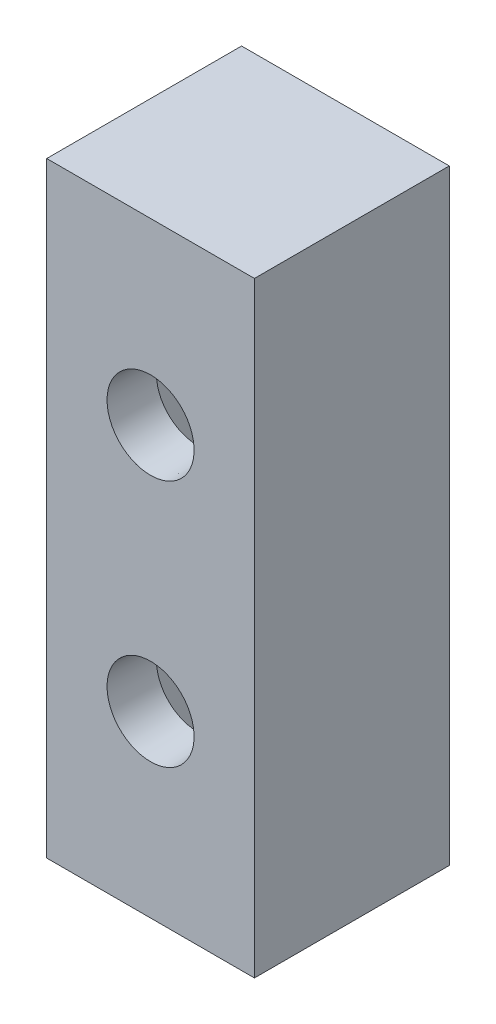
ISO-10303-21;
HEADER;
FILE_DESCRIPTION(('STEP AP214'),'2;1');
FILE_NAME('part.step','',(''),(''),'','','');
FILE_SCHEMA(('AUTOMOTIVE_DESIGN { 1 0 10303 214 1 1 1 1 }'));
ENDSEC;
DATA;
#1=APPLICATION_CONTEXT('core data for automotive mechanical design processes');
#2=APPLICATION_PROTOCOL_DEFINITION('international standard','automotive_design',2000,#1);
#3=PRODUCT_CONTEXT('',#1,'mechanical');
#4=PRODUCT('Part','Part','',(#3));
#5=PRODUCT_RELATED_PRODUCT_CATEGORY('part','',(#4));
#6=PRODUCT_DEFINITION_FORMATION('','',#4);
#7=PRODUCT_DEFINITION_CONTEXT('part definition',#1,'design');
#8=PRODUCT_DEFINITION('design','',#6,#7);
#9=PRODUCT_DEFINITION_SHAPE('','',#8);
#10=(LENGTH_UNIT() NAMED_UNIT(*) SI_UNIT(.MILLI.,.METRE.));
#11=(NAMED_UNIT(*) PLANE_ANGLE_UNIT() SI_UNIT($,.RADIAN.));
#12=(NAMED_UNIT(*) SI_UNIT($,.STERADIAN.) SOLID_ANGLE_UNIT());
#13=UNCERTAINTY_MEASURE_WITH_UNIT(LENGTH_MEASURE(1.E-05),#10,'distance_accuracy_value','');
#14=(GEOMETRIC_REPRESENTATION_CONTEXT(3) GLOBAL_UNCERTAINTY_ASSIGNED_CONTEXT((#13)) GLOBAL_UNIT_ASSIGNED_CONTEXT((#10,
#11,#12)) REPRESENTATION_CONTEXT('',''));
#15=CARTESIAN_POINT('',(0.,0.,0.));
#16=DIRECTION('',(0.,0.,1.));
#17=DIRECTION('',(1.,0.,0.));
#18=AXIS2_PLACEMENT_3D('',#15,#16,#17);
#19=CARTESIAN_POINT('',(0.,0.,3.));
#20=DIRECTION('',(0.,0.,1.));
#21=DIRECTION('',(1.,0.,0.));
#22=AXIS2_PLACEMENT_3D('',#19,#20,#21);
#23=PLANE('',#22);
#24=CARTESIAN_POINT('',(59.5125,6.99999999999998,3.));
#25=DIRECTION('',(0.,0.,-1.));
#26=DIRECTION('',(-1.,0.,0.));
#27=AXIS2_PLACEMENT_3D('',#24,#25,#26);
#28=CIRCLE('',#27,2.45722333784913);
#29=CARTESIAN_POINT('',(57.0552766621509,6.99999999999998,3.));
#30=VERTEX_POINT('',#29);
#31=EDGE_CURVE('E154',#30,#30,#28,.T.);
#32=ORIENTED_EDGE('',*,*,#31,.T.);
#33=EDGE_LOOP('',(#32));
#34=FACE_BOUND('',#33,.T.);
#35=CARTESIAN_POINT('',(59.5125,-6.99999999999998,3.));
#36=DIRECTION('',(0.,0.,-1.));
#37=DIRECTION('',(-1.,0.,0.));
#38=AXIS2_PLACEMENT_3D('',#35,#36,#37);
#39=CIRCLE('',#38,2.45722333784913);
#40=CARTESIAN_POINT('',(57.0552766621509,-6.99999999999998,3.));
#41=VERTEX_POINT('',#40);
#42=EDGE_CURVE('E174',#41,#41,#39,.T.);
#43=ORIENTED_EDGE('',*,*,#42,.T.);
#44=EDGE_LOOP('',(#43));
#45=FACE_BOUND('',#44,.T.);
#46=DIRECTION('',(-1.,0.,0.));
#47=VECTOR('',#46,1.);
#48=CARTESIAN_POINT('',(65.375,17.1,3.));
#49=LINE('',#48,#47);
#50=CARTESIAN_POINT('',(65.375,17.1,3.));
#51=VERTEX_POINT('',#50);
#52=CARTESIAN_POINT('',(53.65,17.1,3.));
#53=VERTEX_POINT('',#52);
#54=EDGE_CURVE('E121',#51,#53,#49,.T.);
#55=ORIENTED_EDGE('',*,*,#54,.T.);
#56=DIRECTION('',(0.,-1.,0.));
#57=VECTOR('',#56,1.);
#58=CARTESIAN_POINT('',(53.65,17.1,3.));
#59=LINE('',#58,#57);
#60=CARTESIAN_POINT('',(53.65,-17.1,3.));
#61=VERTEX_POINT('',#60);
#62=EDGE_CURVE('E128',#53,#61,#59,.T.);
#63=ORIENTED_EDGE('',*,*,#62,.T.);
#64=DIRECTION('',(1.,0.,0.));
#65=VECTOR('',#64,1.);
#66=CARTESIAN_POINT('',(53.65,-17.1,3.));
#67=LINE('',#66,#65);
#68=CARTESIAN_POINT('',(65.375,-17.1,3.));
#69=VERTEX_POINT('',#68);
#70=EDGE_CURVE('E133',#61,#69,#67,.T.);
#71=ORIENTED_EDGE('',*,*,#70,.T.);
#72=DIRECTION('',(0.,1.,0.));
#73=VECTOR('',#72,1.);
#74=CARTESIAN_POINT('',(65.375,-17.1,3.));
#75=LINE('',#74,#73);
#76=EDGE_CURVE('E125',#69,#51,#75,.T.);
#77=ORIENTED_EDGE('',*,*,#76,.T.);
#78=EDGE_LOOP('',(#55,#63,#71,#77));
#79=FACE_BOUND('',#78,.T.);
#80=ADVANCED_FACE('F36',(#34,#45,#79),#23,.T.);
#81=CARTESIAN_POINT('',(54.75,-16.35,-52.1540540603678));
#82=DIRECTION('',(0.,-1.,0.));
#83=DIRECTION('',(1.,0.,0.));
#84=AXIS2_PLACEMENT_3D('',#81,#82,#83);
#85=PLANE('',#84);
#86=DIRECTION('',(0.,0.,1.));
#87=VECTOR('',#86,1.);
#88=CARTESIAN_POINT('',(54.4,-16.35,-52.1540540603678));
#89=LINE('',#88,#87);
#90=CARTESIAN_POINT('',(54.4,-16.35,-8.));
#91=VERTEX_POINT('',#90);
#92=CARTESIAN_POINT('',(54.4,-16.35,0.35));
#93=VERTEX_POINT('',#92);
#94=EDGE_CURVE('E150',#91,#93,#89,.T.);
#95=ORIENTED_EDGE('',*,*,#94,.T.);
#96=DIRECTION('',(1.,0.,0.));
#97=VECTOR('',#96,1.);
#98=CARTESIAN_POINT('',(0.,-16.35,0.35));
#99=LINE('',#98,#97);
#100=CARTESIAN_POINT('',(64.625,-16.35,0.35));
#101=VERTEX_POINT('',#100);
#102=EDGE_CURVE('E155',#93,#101,#99,.T.);
#103=ORIENTED_EDGE('',*,*,#102,.T.);
#104=DIRECTION('',(0.,0.,1.));
#105=VECTOR('',#104,1.);
#106=CARTESIAN_POINT('',(64.625,-16.35,-52.1540540603678));
#107=LINE('',#106,#105);
#108=CARTESIAN_POINT('',(64.625,-16.35,-8.));
#109=VERTEX_POINT('',#108);
#110=EDGE_CURVE('E153',#109,#101,#107,.T.);
#111=ORIENTED_EDGE('',*,*,#110,.F.);
#112=DIRECTION('',(-1.,0.,0.));
#113=VECTOR('',#112,1.);
#114=CARTESIAN_POINT('',(54.75,-16.35,-8.));
#115=LINE('',#114,#113);
#116=EDGE_CURVE('E146',#109,#91,#115,.T.);
#117=ORIENTED_EDGE('',*,*,#116,.T.);
#118=EDGE_LOOP('',(#95,#103,#111,#117));
#119=FACE_BOUND('',#118,.T.);
#120=ADVANCED_FACE('F202',(#119),#85,.F.);
#121=CARTESIAN_POINT('',(64.625,-16.,-52.1540540603678));
#122=DIRECTION('',(1.,0.,0.));
#123=DIRECTION('',(0.,1.,0.));
#124=AXIS2_PLACEMENT_3D('',#121,#122,#123);
#125=PLANE('',#124);
#126=ORIENTED_EDGE('',*,*,#110,.T.);
#127=DIRECTION('',(0.,1.,0.));
#128=VECTOR('',#127,1.);
#129=CARTESIAN_POINT('',(64.625,0.,0.35));
#130=LINE('',#129,#128);
#131=CARTESIAN_POINT('',(64.625,16.35,0.35));
#132=VERTEX_POINT('',#131);
#133=EDGE_CURVE('E158',#101,#132,#130,.T.);
#134=ORIENTED_EDGE('',*,*,#133,.T.);
#135=DIRECTION('',(0.,0.,1.));
#136=VECTOR('',#135,1.);
#137=CARTESIAN_POINT('',(64.625,16.35,-52.1540540603678));
#138=LINE('',#137,#136);
#139=CARTESIAN_POINT('',(64.625,16.35,-8.));
#140=VERTEX_POINT('',#139);
#141=EDGE_CURVE('E138',#140,#132,#138,.T.);
#142=ORIENTED_EDGE('',*,*,#141,.F.);
#143=DIRECTION('',(0.,-1.,0.));
#144=VECTOR('',#143,1.);
#145=CARTESIAN_POINT('',(64.625,-16.,-8.));
#146=LINE('',#145,#144);
#147=EDGE_CURVE('E168',#140,#109,#146,.T.);
#148=ORIENTED_EDGE('',*,*,#147,.T.);
#149=EDGE_LOOP('',(#126,#134,#142,#148));
#150=FACE_BOUND('',#149,.T.);
#151=ADVANCED_FACE('F209',(#150),#125,.F.);
#152=CARTESIAN_POINT('',(64.275,16.35,-52.1540540603678));
#153=DIRECTION('',(0.,1.,0.));
#154=DIRECTION('',(-1.,0.,0.));
#155=AXIS2_PLACEMENT_3D('',#152,#153,#154);
#156=PLANE('',#155);
#157=ORIENTED_EDGE('',*,*,#141,.T.);
#158=DIRECTION('',(-1.,0.,0.));
#159=VECTOR('',#158,1.);
#160=CARTESIAN_POINT('',(0.,16.35,0.35));
#161=LINE('',#160,#159);
#162=CARTESIAN_POINT('',(54.4,16.35,0.35));
#163=VERTEX_POINT('',#162);
#164=EDGE_CURVE('E46',#132,#163,#161,.T.);
#165=ORIENTED_EDGE('',*,*,#164,.T.);
#166=DIRECTION('',(0.,0.,1.));
#167=VECTOR('',#166,1.);
#168=CARTESIAN_POINT('',(54.4,16.35,-52.1540540603678));
#169=LINE('',#168,#167);
#170=CARTESIAN_POINT('',(54.4,16.35,-8.));
#171=VERTEX_POINT('',#170);
#172=EDGE_CURVE('E135',#171,#163,#169,.T.);
#173=ORIENTED_EDGE('',*,*,#172,.F.);
#174=DIRECTION('',(1.,0.,0.));
#175=VECTOR('',#174,1.);
#176=CARTESIAN_POINT('',(64.275,16.35,-8.));
#177=LINE('',#176,#175);
#178=EDGE_CURVE('E74',#171,#140,#177,.T.);
#179=ORIENTED_EDGE('',*,*,#178,.T.);
#180=EDGE_LOOP('',(#157,#165,#173,#179));
#181=FACE_BOUND('',#180,.T.);
#182=ADVANCED_FACE('F217',(#181),#156,.F.);
#183=CARTESIAN_POINT('',(54.4,16.,-52.1540540603678));
#184=DIRECTION('',(-1.,0.,0.));
#185=DIRECTION('',(0.,-1.,0.));
#186=AXIS2_PLACEMENT_3D('',#183,#184,#185);
#187=PLANE('',#186);
#188=ORIENTED_EDGE('',*,*,#172,.T.);
#189=DIRECTION('',(0.,-1.,0.));
#190=VECTOR('',#189,1.);
#191=CARTESIAN_POINT('',(54.4,0.,0.35));
#192=LINE('',#191,#190);
#193=EDGE_CURVE('E13',#163,#93,#192,.T.);
#194=ORIENTED_EDGE('',*,*,#193,.T.);
#195=ORIENTED_EDGE('',*,*,#94,.F.);
#196=DIRECTION('',(0.,1.,0.));
#197=VECTOR('',#196,1.);
#198=CARTESIAN_POINT('',(54.4,16.,-8.));
#199=LINE('',#198,#197);
#200=EDGE_CURVE('E98',#91,#171,#199,.T.);
#201=ORIENTED_EDGE('',*,*,#200,.T.);
#202=EDGE_LOOP('',(#188,#194,#195,#201));
#203=FACE_BOUND('',#202,.T.);
#204=ADVANCED_FACE('F214',(#203),#187,.F.);
#205=CARTESIAN_POINT('',(53.65,17.1,-52.1540540603678));
#206=DIRECTION('',(-1.,0.,0.));
#207=DIRECTION('',(0.,0.,1.));
#208=AXIS2_PLACEMENT_3D('',#205,#206,#207);
#209=PLANE('',#208);
#210=DIRECTION('',(0.,1.,0.));
#211=VECTOR('',#210,1.);
#212=CARTESIAN_POINT('',(53.65,17.1,-8.));
#213=LINE('',#212,#211);
#214=CARTESIAN_POINT('',(53.65,-17.1,-8.));
#215=VERTEX_POINT('',#214);
#216=CARTESIAN_POINT('',(53.65,17.1,-8.));
#217=VERTEX_POINT('',#216);
#218=EDGE_CURVE('E92',#215,#217,#213,.T.);
#219=ORIENTED_EDGE('',*,*,#218,.F.);
#220=DIRECTION('',(0.,0.,1.));
#221=VECTOR('',#220,1.);
#222=CARTESIAN_POINT('',(53.65,-17.1,-52.1540540603678));
#223=LINE('',#222,#221);
#224=EDGE_CURVE('E124',#215,#61,#223,.T.);
#225=ORIENTED_EDGE('',*,*,#224,.T.);
#226=ORIENTED_EDGE('',*,*,#62,.F.);
#227=DIRECTION('',(0.,0.,1.));
#228=VECTOR('',#227,1.);
#229=CARTESIAN_POINT('',(53.65,17.1,-52.1540540603678));
#230=LINE('',#229,#228);
#231=EDGE_CURVE('E117',#217,#53,#230,.T.);
#232=ORIENTED_EDGE('',*,*,#231,.F.);
#233=EDGE_LOOP('',(#219,#225,#226,#232));
#234=FACE_BOUND('',#233,.T.);
#235=ADVANCED_FACE('F129',(#234),#209,.T.);
#236=CARTESIAN_POINT('',(53.65,-17.1,-52.1540540603678));
#237=DIRECTION('',(0.,-1.,0.));
#238=DIRECTION('',(0.,0.,-1.));
#239=AXIS2_PLACEMENT_3D('',#236,#237,#238);
#240=PLANE('',#239);
#241=DIRECTION('',(-1.,0.,0.));
#242=VECTOR('',#241,1.);
#243=CARTESIAN_POINT('',(53.65,-17.1,-8.));
#244=LINE('',#243,#242);
#245=CARTESIAN_POINT('',(65.375,-17.1,-8.));
#246=VERTEX_POINT('',#245);
#247=EDGE_CURVE('E94',#246,#215,#244,.T.);
#248=ORIENTED_EDGE('',*,*,#247,.F.);
#249=DIRECTION('',(0.,0.,1.));
#250=VECTOR('',#249,1.);
#251=CARTESIAN_POINT('',(65.375,-17.1,-52.1540540603678));
#252=LINE('',#251,#250);
#253=EDGE_CURVE('E147',#246,#69,#252,.T.);
#254=ORIENTED_EDGE('',*,*,#253,.T.);
#255=ORIENTED_EDGE('',*,*,#70,.F.);
#256=ORIENTED_EDGE('',*,*,#224,.F.);
#257=EDGE_LOOP('',(#248,#254,#255,#256));
#258=FACE_BOUND('',#257,.T.);
#259=ADVANCED_FACE('F190',(#258),#240,.T.);
#260=CARTESIAN_POINT('',(65.375,-17.1,-52.1540540603678));
#261=DIRECTION('',(1.,0.,0.));
#262=DIRECTION('',(0.,0.,-1.));
#263=AXIS2_PLACEMENT_3D('',#260,#261,#262);
#264=PLANE('',#263);
#265=DIRECTION('',(0.,-1.,0.));
#266=VECTOR('',#265,1.);
#267=CARTESIAN_POINT('',(65.375,-17.1,-8.));
#268=LINE('',#267,#266);
#269=CARTESIAN_POINT('',(65.375,17.1,-8.));
#270=VERTEX_POINT('',#269);
#271=EDGE_CURVE('E186',#270,#246,#268,.T.);
#272=ORIENTED_EDGE('',*,*,#271,.F.);
#273=DIRECTION('',(0.,0.,1.));
#274=VECTOR('',#273,1.);
#275=CARTESIAN_POINT('',(65.375,17.1,-52.1540540603678));
#276=LINE('',#275,#274);
#277=EDGE_CURVE('E105',#270,#51,#276,.T.);
#278=ORIENTED_EDGE('',*,*,#277,.T.);
#279=ORIENTED_EDGE('',*,*,#76,.F.);
#280=ORIENTED_EDGE('',*,*,#253,.F.);
#281=EDGE_LOOP('',(#272,#278,#279,#280));
#282=FACE_BOUND('',#281,.T.);
#283=ADVANCED_FACE('F191',(#282),#264,.T.);
#284=CARTESIAN_POINT('',(65.375,17.1,-52.1540540603678));
#285=DIRECTION('',(0.,1.,0.));
#286=DIRECTION('',(0.,0.,1.));
#287=AXIS2_PLACEMENT_3D('',#284,#285,#286);
#288=PLANE('',#287);
#289=DIRECTION('',(1.,0.,0.));
#290=VECTOR('',#289,1.);
#291=CARTESIAN_POINT('',(65.375,17.1,-8.));
#292=LINE('',#291,#290);
#293=EDGE_CURVE('E83',#217,#270,#292,.T.);
#294=ORIENTED_EDGE('',*,*,#293,.F.);
#295=ORIENTED_EDGE('',*,*,#231,.T.);
#296=ORIENTED_EDGE('',*,*,#54,.F.);
#297=ORIENTED_EDGE('',*,*,#277,.F.);
#298=EDGE_LOOP('',(#294,#295,#296,#297));
#299=FACE_BOUND('',#298,.T.);
#300=ADVANCED_FACE('F119',(#299),#288,.T.);
#301=CARTESIAN_POINT('',(0.,0.,-8.));
#302=DIRECTION('',(0.,0.,1.));
#303=DIRECTION('',(1.,0.,0.));
#304=AXIS2_PLACEMENT_3D('',#301,#302,#303);
#305=PLANE('',#304);
#306=ORIENTED_EDGE('',*,*,#293,.T.);
#307=ORIENTED_EDGE('',*,*,#271,.T.);
#308=ORIENTED_EDGE('',*,*,#247,.T.);
#309=ORIENTED_EDGE('',*,*,#218,.T.);
#310=EDGE_LOOP('',(#306,#307,#308,#309));
#311=FACE_BOUND('',#310,.T.);
#312=ORIENTED_EDGE('',*,*,#116,.F.);
#313=ORIENTED_EDGE('',*,*,#147,.F.);
#314=ORIENTED_EDGE('',*,*,#178,.F.);
#315=ORIENTED_EDGE('',*,*,#200,.F.);
#316=EDGE_LOOP('',(#312,#313,#314,#315));
#317=FACE_BOUND('',#316,.T.);
#318=ADVANCED_FACE('F187',(#311,#317),#305,.F.);
#319=CARTESIAN_POINT('',(0.,0.,0.35));
#320=DIRECTION('',(0.,0.,1.));
#321=DIRECTION('',(1.,0.,0.));
#322=AXIS2_PLACEMENT_3D('',#319,#320,#321);
#323=PLANE('',#322);
#324=CARTESIAN_POINT('',(59.5125,6.99999999999998,0.35));
#325=DIRECTION('',(0.,0.,1.));
#326=DIRECTION('',(1.,0.,0.));
#327=AXIS2_PLACEMENT_3D('',#324,#325,#326);
#328=CIRCLE('',#327,2.31834272274907);
#329=CARTESIAN_POINT('',(61.8308427227491,6.99999999999998,0.35));
#330=VERTEX_POINT('',#329);
#331=EDGE_CURVE('E172',#330,#330,#328,.F.);
#332=ORIENTED_EDGE('',*,*,#331,.F.);
#333=EDGE_LOOP('',(#332));
#334=FACE_BOUND('',#333,.T.);
#335=CARTESIAN_POINT('',(59.5125,-6.99999999999998,0.35));
#336=DIRECTION('',(0.,0.,1.));
#337=DIRECTION('',(1.,0.,0.));
#338=AXIS2_PLACEMENT_3D('',#335,#336,#337);
#339=CIRCLE('',#338,2.31834272274907);
#340=CARTESIAN_POINT('',(61.8308427227491,-6.99999999999998,0.35));
#341=VERTEX_POINT('',#340);
#342=EDGE_CURVE('E40',#341,#341,#339,.F.);
#343=ORIENTED_EDGE('',*,*,#342,.F.);
#344=EDGE_LOOP('',(#343));
#345=FACE_BOUND('',#344,.T.);
#346=ORIENTED_EDGE('',*,*,#102,.F.);
#347=ORIENTED_EDGE('',*,*,#193,.F.);
#348=ORIENTED_EDGE('',*,*,#164,.F.);
#349=ORIENTED_EDGE('',*,*,#133,.F.);
#350=EDGE_LOOP('',(#346,#347,#348,#349));
#351=FACE_BOUND('',#350,.T.);
#352=ADVANCED_FACE('F38',(#334,#345,#351),#323,.F.);
#353=CARTESIAN_POINT('',(59.5125,-6.99999999999998,0.));
#354=DIRECTION('',(0.,0.,1.));
#355=DIRECTION('',(-1.,0.,0.));
#356=AXIS2_PLACEMENT_3D('',#353,#354,#355);
#357=CONICAL_SURFACE('',#356,2.30000000000001,0.05235987755983);
#358=ORIENTED_EDGE('',*,*,#42,.F.);
#359=EDGE_LOOP('',(#358));
#360=FACE_BOUND('',#359,.T.);
#361=ORIENTED_EDGE('',*,*,#342,.T.);
#362=EDGE_LOOP('',(#361));
#363=FACE_BOUND('',#362,.T.);
#364=ADVANCED_FACE('F231',(#360,#363),#357,.F.);
#365=CARTESIAN_POINT('',(59.5125,6.99999999999998,0.));
#366=DIRECTION('',(0.,0.,1.));
#367=DIRECTION('',(-1.,0.,0.));
#368=AXIS2_PLACEMENT_3D('',#365,#366,#367);
#369=CONICAL_SURFACE('',#368,2.30000000000001,0.05235987755983);
#370=ORIENTED_EDGE('',*,*,#31,.F.);
#371=EDGE_LOOP('',(#370));
#372=FACE_BOUND('',#371,.T.);
#373=ORIENTED_EDGE('',*,*,#331,.T.);
#374=EDGE_LOOP('',(#373));
#375=FACE_BOUND('',#374,.T.);
#376=ADVANCED_FACE('F236',(#372,#375),#369,.F.);
#377=CLOSED_SHELL('',(#80,#120,#151,#182,#204,#235,#259,#283,#300,#318,#352,#364,#376));
#378=MANIFOLD_SOLID_BREP('B2',#377);
#379=ADVANCED_BREP_SHAPE_REPRESENTATION('',(#18,#378),#14);
#380=SHAPE_DEFINITION_REPRESENTATION(#9,#379);
ENDSEC;
END-ISO-10303-21;
